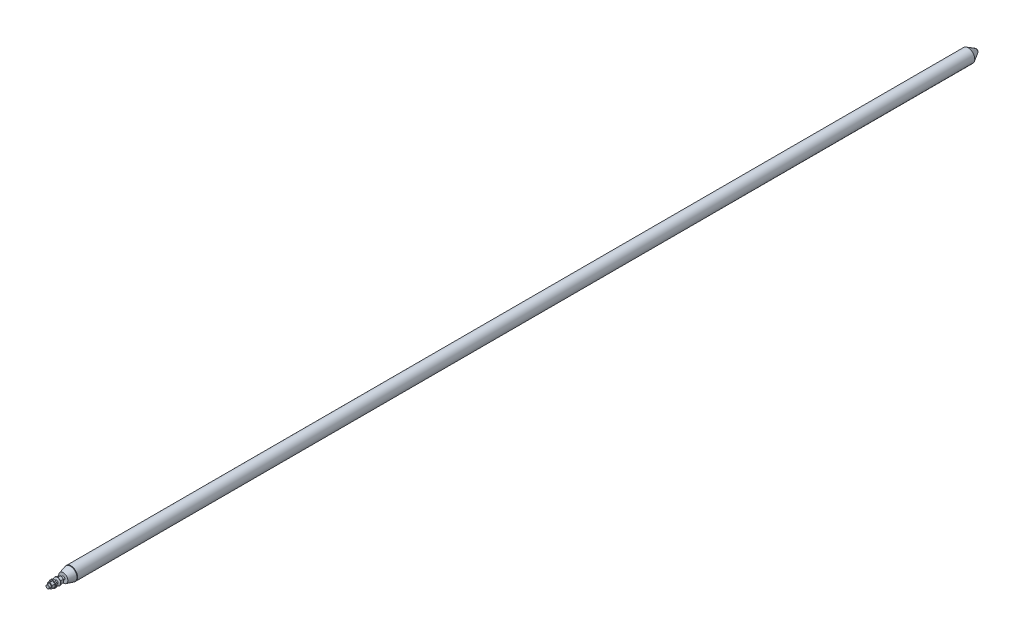
ISO-10303-21;
HEADER;
FILE_DESCRIPTION(('STEP AP214'),'2;1');
FILE_NAME('part.step','',(''),(''),'','','');
FILE_SCHEMA(('AUTOMOTIVE_DESIGN { 1 0 10303 214 1 1 1 1 }'));
ENDSEC;
DATA;
#1=APPLICATION_CONTEXT('core data for automotive mechanical design processes');
#2=APPLICATION_PROTOCOL_DEFINITION('international standard','automotive_design',2000,#1);
#3=PRODUCT_CONTEXT('',#1,'mechanical');
#4=PRODUCT('Part','Part','',(#3));
#5=PRODUCT_RELATED_PRODUCT_CATEGORY('part','',(#4));
#6=PRODUCT_DEFINITION_FORMATION('','',#4);
#7=PRODUCT_DEFINITION_CONTEXT('part definition',#1,'design');
#8=PRODUCT_DEFINITION('design','',#6,#7);
#9=PRODUCT_DEFINITION_SHAPE('','',#8);
#10=(LENGTH_UNIT() NAMED_UNIT(*) SI_UNIT(.MILLI.,.METRE.));
#11=(NAMED_UNIT(*) PLANE_ANGLE_UNIT() SI_UNIT($,.RADIAN.));
#12=(NAMED_UNIT(*) SI_UNIT($,.STERADIAN.) SOLID_ANGLE_UNIT());
#13=UNCERTAINTY_MEASURE_WITH_UNIT(LENGTH_MEASURE(1.E-05),#10,'distance_accuracy_value','');
#14=(GEOMETRIC_REPRESENTATION_CONTEXT(3) GLOBAL_UNCERTAINTY_ASSIGNED_CONTEXT((#13)) GLOBAL_UNIT_ASSIGNED_CONTEXT((#10,
#11,#12)) REPRESENTATION_CONTEXT('',''));
#15=CARTESIAN_POINT('',(0.,0.,0.));
#16=DIRECTION('',(0.,0.,1.));
#17=DIRECTION('',(1.,0.,0.));
#18=AXIS2_PLACEMENT_3D('',#15,#16,#17);
#19=CARTESIAN_POINT('',(0.,16.6751,52.1089983991226));
#20=DIRECTION('',(0.,0.,1.));
#21=DIRECTION('',(1.,0.,0.));
#22=AXIS2_PLACEMENT_3D('',#19,#20,#21);
#23=PLANE('',#22);
#24=CARTESIAN_POINT('',(0.,0.,52.1089983991226));
#25=DIRECTION('',(0.,0.,-1.));
#26=DIRECTION('',(-1.,0.,0.));
#27=AXIS2_PLACEMENT_3D('',#24,#25,#26);
#28=CIRCLE('',#27,16.6751);
#29=CARTESIAN_POINT('',(-16.6751,0.,52.1089983991226));
#30=VERTEX_POINT('',#29);
#31=EDGE_CURVE('E149',#30,#30,#28,.T.);
#32=ORIENTED_EDGE('',*,*,#31,.F.);
#33=EDGE_LOOP('',(#32));
#34=FACE_BOUND('',#33,.T.);
#35=DIRECTION('',(0.866025403784438,0.5,0.));
#36=VECTOR('',#35,1.);
#37=CARTESIAN_POINT('',(0.,-13.7554856334967,52.1089983991226));
#38=LINE('',#37,#36);
#39=CARTESIAN_POINT('',(0.,-13.7554856334967,52.1089983991226));
#40=VERTEX_POINT('',#39);
#41=CARTESIAN_POINT('',(11.9126,-6.87774281674833,52.1089983991226));
#42=VERTEX_POINT('',#41);
#43=EDGE_CURVE('E626',#40,#42,#38,.T.);
#44=ORIENTED_EDGE('',*,*,#43,.F.);
#45=DIRECTION('',(0.866025403784439,-0.499999999999999,0.));
#46=VECTOR('',#45,1.);
#47=CARTESIAN_POINT('',(-11.9126,-6.87774281674834,52.1089983991226));
#48=LINE('',#47,#46);
#49=CARTESIAN_POINT('',(-11.9126,-6.87774281674834,52.1089983991226));
#50=VERTEX_POINT('',#49);
#51=EDGE_CURVE('E147',#50,#40,#48,.T.);
#52=ORIENTED_EDGE('',*,*,#51,.F.);
#53=DIRECTION('',(0.,-1.,0.));
#54=VECTOR('',#53,1.);
#55=CARTESIAN_POINT('',(-11.9126,6.87774281674833,52.1089983991226));
#56=LINE('',#55,#54);
#57=CARTESIAN_POINT('',(-11.9126,6.87774281674833,52.1089983991226));
#58=VERTEX_POINT('',#57);
#59=EDGE_CURVE('E143',#58,#50,#56,.T.);
#60=ORIENTED_EDGE('',*,*,#59,.F.);
#61=DIRECTION('',(-0.866025403784439,-0.5,0.));
#62=VECTOR('',#61,1.);
#63=CARTESIAN_POINT('',(0.,13.7554856334967,52.1089983991226));
#64=LINE('',#63,#62);
#65=CARTESIAN_POINT('',(0.,13.7554856334967,52.1089983991226));
#66=VERTEX_POINT('',#65);
#67=EDGE_CURVE('E622',#66,#58,#64,.T.);
#68=ORIENTED_EDGE('',*,*,#67,.F.);
#69=DIRECTION('',(-0.866025403784439,0.5,0.));
#70=VECTOR('',#69,1.);
#71=CARTESIAN_POINT('',(11.9126,6.87774281674833,52.1089983991226));
#72=LINE('',#71,#70);
#73=CARTESIAN_POINT('',(11.9126,6.87774281674833,52.1089983991226));
#74=VERTEX_POINT('',#73);
#75=EDGE_CURVE('E634',#74,#66,#72,.T.);
#76=ORIENTED_EDGE('',*,*,#75,.F.);
#77=DIRECTION('',(0.,1.,0.));
#78=VECTOR('',#77,1.);
#79=CARTESIAN_POINT('',(11.9126,-6.87774281674833,52.1089983991226));
#80=LINE('',#79,#78);
#81=EDGE_CURVE('E628',#42,#74,#80,.T.);
#82=ORIENTED_EDGE('',*,*,#81,.F.);
#83=EDGE_LOOP('',(#44,#52,#60,#68,#76,#82));
#84=FACE_BOUND('',#83,.T.);
#85=ADVANCED_FACE('F33',(#34,#84),#23,.T.);
#86=CARTESIAN_POINT('',(0.,0.,0.));
#87=DIRECTION('',(0.,0.,-1.));
#88=DIRECTION('',(-1.,0.,0.));
#89=AXIS2_PLACEMENT_3D('',#86,#87,#88);
#90=CYLINDRICAL_SURFACE('',#89,7.93749999999999);
#91=CARTESIAN_POINT('',(0.,0.,46.2923983991226));
#92=DIRECTION('',(0.,0.,-1.));
#93=DIRECTION('',(-1.,0.,0.));
#94=AXIS2_PLACEMENT_3D('',#91,#92,#93);
#95=CIRCLE('',#94,7.93749999999999);
#96=CARTESIAN_POINT('',(-7.93749999999999,0.,46.2923983991226));
#97=VERTEX_POINT('',#96);
#98=EDGE_CURVE('E42',#97,#97,#95,.F.);
#99=ORIENTED_EDGE('',*,*,#98,.F.);
#100=EDGE_LOOP('',(#99));
#101=FACE_BOUND('',#100,.T.);
#102=CARTESIAN_POINT('',(0.,0.,33.5923983991226));
#103=DIRECTION('',(0.,0.,-1.));
#104=DIRECTION('',(-1.,0.,0.));
#105=AXIS2_PLACEMENT_3D('',#102,#103,#104);
#106=CIRCLE('',#105,7.93749999999999);
#107=CARTESIAN_POINT('',(0.,7.93749999999996,33.5923983991227));
#108=VERTEX_POINT('',#107);
#109=EDGE_CURVE('E236',#108,#108,#106,.T.);
#110=ORIENTED_EDGE('',*,*,#109,.F.);
#111=EDGE_LOOP('',(#110));
#112=FACE_BOUND('',#111,.T.);
#113=ADVANCED_FACE('F248',(#101,#112),#90,.T.);
#114=CARTESIAN_POINT('',(0.,0.,0.));
#115=DIRECTION('',(0.,0.,-1.));
#116=DIRECTION('',(-1.,0.,0.));
#117=AXIS2_PLACEMENT_3D('',#114,#115,#116);
#118=CIRCLE('',#117,7.93749999999999);
#119=CARTESIAN_POINT('',(-7.93749999999999,0.,0.));
#120=VERTEX_POINT('',#119);
#121=EDGE_CURVE('E224',#120,#120,#118,.T.);
#122=ORIENTED_EDGE('',*,*,#121,.F.);
#123=EDGE_LOOP('',(#122));
#124=FACE_BOUND('',#123,.T.);
#125=CARTESIAN_POINT('',(0.,0.,12.690475));
#126=DIRECTION('',(0.,0.,1.));
#127=DIRECTION('',(1.,0.,0.));
#128=AXIS2_PLACEMENT_3D('',#125,#126,#127);
#129=CIRCLE('',#128,7.93749999999999);
#130=CARTESIAN_POINT('',(7.93749999999999,0.,12.690475));
#131=VERTEX_POINT('',#130);
#132=EDGE_CURVE('E201',#131,#131,#129,.F.);
#133=ORIENTED_EDGE('',*,*,#132,.T.);
#134=EDGE_LOOP('',(#133));
#135=FACE_BOUND('',#134,.T.);
#136=ADVANCED_FACE('F251',(#124,#135),#90,.T.);
#137=CARTESIAN_POINT('',(0.,0.,-38.1));
#138=DIRECTION('',(0.,0.,1.));
#139=DIRECTION('',(1.,0.,0.));
#140=AXIS2_PLACEMENT_3D('',#137,#138,#139);
#141=CONICAL_SURFACE('',#140,28.575,0.780728808749583);
#142=CARTESIAN_POINT('',(0.,0.,-34.8952102827305));
#143=DIRECTION('',(0.,0.,-1.));
#144=DIRECTION('',(-1.,0.,0.));
#145=AXIS2_PLACEMENT_3D('',#142,#143,#144);
#146=CIRCLE('',#145,31.75);
#147=CARTESIAN_POINT('',(-31.75,0.,-34.8952102827305));
#148=VERTEX_POINT('',#147);
#149=EDGE_CURVE('E230',#148,#148,#146,.T.);
#150=ORIENTED_EDGE('',*,*,#149,.T.);
#151=EDGE_LOOP('',(#150));
#152=FACE_BOUND('',#151,.T.);
#153=CARTESIAN_POINT('',(0.,0.,-38.1));
#154=DIRECTION('',(0.,0.,-1.));
#155=DIRECTION('',(-1.,0.,0.));
#156=AXIS2_PLACEMENT_3D('',#153,#154,#155);
#157=CIRCLE('',#156,28.575);
#158=CARTESIAN_POINT('',(-28.575,0.,-38.1));
#159=VERTEX_POINT('',#158);
#160=EDGE_CURVE('E233',#159,#159,#157,.T.);
#161=ORIENTED_EDGE('',*,*,#160,.F.);
#162=EDGE_LOOP('',(#161));
#163=FACE_BOUND('',#162,.T.);
#164=ADVANCED_FACE('F454',(#152,#163),#141,.T.);
#165=CARTESIAN_POINT('',(0.,0.,-34.8952102827305));
#166=DIRECTION('',(0.,0.,-1.));
#167=DIRECTION('',(-1.,0.,0.));
#168=AXIS2_PLACEMENT_3D('',#165,#166,#167);
#169=CONICAL_SURFACE('',#168,31.75,0.266468742447018);
#170=CARTESIAN_POINT('',(0.,0.,0.));
#171=DIRECTION('',(0.,0.,-1.));
#172=DIRECTION('',(-1.,0.,0.));
#173=AXIS2_PLACEMENT_3D('',#170,#171,#172);
#174=CIRCLE('',#173,22.225);
#175=CARTESIAN_POINT('',(-22.225,0.,0.));
#176=VERTEX_POINT('',#175);
#177=EDGE_CURVE('E227',#176,#176,#174,.T.);
#178=ORIENTED_EDGE('',*,*,#177,.T.);
#179=EDGE_LOOP('',(#178));
#180=FACE_BOUND('',#179,.T.);
#181=ORIENTED_EDGE('',*,*,#149,.F.);
#182=EDGE_LOOP('',(#181));
#183=FACE_BOUND('',#182,.T.);
#184=ADVANCED_FACE('F540',(#180,#183),#169,.T.);
#185=CARTESIAN_POINT('',(0.,7.93749999999999,0.));
#186=DIRECTION('',(0.,0.,1.));
#187=DIRECTION('',(1.,0.,0.));
#188=AXIS2_PLACEMENT_3D('',#185,#186,#187);
#189=PLANE('',#188);
#190=ORIENTED_EDGE('',*,*,#121,.T.);
#191=EDGE_LOOP('',(#190));
#192=FACE_BOUND('',#191,.T.);
#193=ORIENTED_EDGE('',*,*,#177,.F.);
#194=EDGE_LOOP('',(#193));
#195=FACE_BOUND('',#194,.T.);
#196=ADVANCED_FACE('F527',(#192,#195),#189,.T.);
#197=CARTESIAN_POINT('',(0.,31.75,-38.1));
#198=DIRECTION('',(0.,0.,-1.));
#199=DIRECTION('',(-1.,0.,0.));
#200=AXIS2_PLACEMENT_3D('',#197,#198,#199);
#201=PLANE('',#200);
#202=ORIENTED_EDGE('',*,*,#160,.T.);
#203=EDGE_LOOP('',(#202));
#204=FACE_BOUND('',#203,.T.);
#205=CARTESIAN_POINT('',(0.,0.,-38.1));
#206=DIRECTION('',(0.,0.,1.));
#207=DIRECTION('',(1.,0.,0.));
#208=AXIS2_PLACEMENT_3D('',#205,#206,#207);
#209=CIRCLE('',#208,31.75);
#210=CARTESIAN_POINT('',(31.75,0.,-38.1));
#211=VERTEX_POINT('',#210);
#212=EDGE_CURVE('E205',#211,#211,#209,.T.);
#213=ORIENTED_EDGE('',*,*,#212,.T.);
#214=EDGE_LOOP('',(#213));
#215=FACE_BOUND('',#214,.T.);
#216=ADVANCED_FACE('F523',(#204,#215),#201,.F.);
#217=CARTESIAN_POINT('',(0.,0.,29.7434));
#218=DIRECTION('',(0.,0.,1.));
#219=DIRECTION('',(1.,0.,0.));
#220=AXIS2_PLACEMENT_3D('',#217,#218,#219);
#221=CYLINDRICAL_SURFACE('',#220,31.75);
#222=ORIENTED_EDGE('',*,*,#212,.F.);
#223=EDGE_LOOP('',(#222));
#224=FACE_BOUND('',#223,.T.);
#225=CARTESIAN_POINT('',(0.,0.,-4408.67479249755));
#226=DIRECTION('',(0.,0.,1.));
#227=DIRECTION('',(1.,0.,0.));
#228=AXIS2_PLACEMENT_3D('',#225,#226,#227);
#229=CIRCLE('',#228,31.75);
#230=CARTESIAN_POINT('',(31.75,0.,-4408.67479249755));
#231=VERTEX_POINT('',#230);
#232=EDGE_CURVE('E208',#231,#231,#229,.T.);
#233=ORIENTED_EDGE('',*,*,#232,.T.);
#234=EDGE_LOOP('',(#233));
#235=FACE_BOUND('',#234,.T.);
#236=ADVANCED_FACE('F526',(#224,#235),#221,.T.);
#237=CARTESIAN_POINT('',(0.,0.,-4444.61740563787));
#238=DIRECTION('',(0.,0.,1.));
#239=DIRECTION('',(1.,0.,0.));
#240=AXIS2_PLACEMENT_3D('',#237,#238,#239);
#241=CONICAL_SURFACE('',#240,10.9985226280625,0.523598775598292);
#242=ORIENTED_EDGE('',*,*,#232,.F.);
#243=EDGE_LOOP('',(#242));
#244=FACE_BOUND('',#243,.T.);
#245=CARTESIAN_POINT('',(0.,0.,-4444.61740563787));
#246=DIRECTION('',(0.,0.,1.));
#247=DIRECTION('',(1.,0.,0.));
#248=AXIS2_PLACEMENT_3D('',#245,#246,#247);
#249=CIRCLE('',#248,10.9985226280625);
#250=CARTESIAN_POINT('',(10.9985226280625,0.,-4444.61740563787));
#251=VERTEX_POINT('',#250);
#252=EDGE_CURVE('E211',#251,#251,#249,.T.);
#253=ORIENTED_EDGE('',*,*,#252,.T.);
#254=EDGE_LOOP('',(#253));
#255=FACE_BOUND('',#254,.T.);
#256=ADVANCED_FACE('F531',(#244,#255),#241,.T.);
#257=CARTESIAN_POINT('',(0.,0.,-4438.26740563787));
#258=DIRECTION('',(0.,0.,1.));
#259=DIRECTION('',(0.,1.,0.));
#260=AXIS2_PLACEMENT_3D('',#257,#258,#259);
#261=SPHERICAL_SURFACE('',#260,12.7);
#262=ORIENTED_EDGE('',*,*,#252,.F.);
#263=EDGE_LOOP('',(#262));
#264=FACE_BOUND('',#263,.T.);
#265=ADVANCED_FACE('F464',(#264),#261,.T.);
#266=CARTESIAN_POINT('',(13.5001,-7.79428636908687,12.690475));
#267=DIRECTION('',(-0.499999999999999,0.866025403784439,0.));
#268=DIRECTION('',(-0.866025403784439,-0.5,0.));
#269=AXIS2_PLACEMENT_3D('',#266,#267,#268);
#270=PLANE('',#269);
#271=DIRECTION('',(-0.866025403784439,-0.499999999999999,0.));
#272=VECTOR('',#271,1.);
#273=CARTESIAN_POINT('',(13.5001,-7.79428636908687,28.1686));
#274=LINE('',#273,#272);
#275=CARTESIAN_POINT('',(13.5001,-7.79428636908687,28.1686));
#276=VERTEX_POINT('',#275);
#277=CARTESIAN_POINT('',(0.,-15.5885727381737,28.1686));
#278=VERTEX_POINT('',#277);
#279=EDGE_CURVE('E160',#276,#278,#274,.T.);
#280=ORIENTED_EDGE('',*,*,#279,.T.);
#281=DIRECTION('',(0.,0.,1.));
#282=VECTOR('',#281,1.);
#283=CARTESIAN_POINT('',(0.,-15.5885727381737,12.690475));
#284=LINE('',#283,#282);
#285=CARTESIAN_POINT('',(0.,-15.5885727381737,12.690475));
#286=VERTEX_POINT('',#285);
#287=EDGE_CURVE('E199',#286,#278,#284,.T.);
#288=ORIENTED_EDGE('',*,*,#287,.F.);
#289=DIRECTION('',(-0.866025403784439,-0.499999999999999,0.));
#290=VECTOR('',#289,1.);
#291=CARTESIAN_POINT('',(13.5001,-7.79428636908687,12.690475));
#292=LINE('',#291,#290);
#293=CARTESIAN_POINT('',(13.5001,-7.79428636908687,12.690475));
#294=VERTEX_POINT('',#293);
#295=EDGE_CURVE('E161',#294,#286,#292,.T.);
#296=ORIENTED_EDGE('',*,*,#295,.F.);
#297=DIRECTION('',(0.,0.,1.));
#298=VECTOR('',#297,1.);
#299=CARTESIAN_POINT('',(13.5001,-7.79428636908687,12.690475));
#300=LINE('',#299,#298);
#301=EDGE_CURVE('E175',#294,#276,#300,.T.);
#302=ORIENTED_EDGE('',*,*,#301,.T.);
#303=EDGE_LOOP('',(#280,#288,#296,#302));
#304=FACE_BOUND('',#303,.T.);
#305=ADVANCED_FACE('F292',(#304),#270,.F.);
#306=CARTESIAN_POINT('',(0.,-15.5885727381737,12.690475));
#307=DIRECTION('',(0.5,0.866025403784438,0.));
#308=DIRECTION('',(-0.866025403784438,0.5,0.));
#309=AXIS2_PLACEMENT_3D('',#306,#307,#308);
#310=PLANE('',#309);
#311=DIRECTION('',(-0.866025403784438,0.5,0.));
#312=VECTOR('',#311,1.);
#313=CARTESIAN_POINT('',(0.,-15.5885727381737,28.1686));
#314=LINE('',#313,#312);
#315=CARTESIAN_POINT('',(-13.5001,-7.79428636908686,28.1686));
#316=VERTEX_POINT('',#315);
#317=EDGE_CURVE('E178',#278,#316,#314,.T.);
#318=ORIENTED_EDGE('',*,*,#317,.T.);
#319=DIRECTION('',(0.,0.,1.));
#320=VECTOR('',#319,1.);
#321=CARTESIAN_POINT('',(-13.5001,-7.79428636908686,12.690475));
#322=LINE('',#321,#320);
#323=CARTESIAN_POINT('',(-13.5001,-7.79428636908686,12.690475));
#324=VERTEX_POINT('',#323);
#325=EDGE_CURVE('E196',#324,#316,#322,.T.);
#326=ORIENTED_EDGE('',*,*,#325,.F.);
#327=DIRECTION('',(-0.866025403784438,0.5,0.));
#328=VECTOR('',#327,1.);
#329=CARTESIAN_POINT('',(0.,-15.5885727381737,12.690475));
#330=LINE('',#329,#328);
#331=EDGE_CURVE('E164',#286,#324,#330,.T.);
#332=ORIENTED_EDGE('',*,*,#331,.F.);
#333=ORIENTED_EDGE('',*,*,#287,.T.);
#334=EDGE_LOOP('',(#318,#326,#332,#333));
#335=FACE_BOUND('',#334,.T.);
#336=ADVANCED_FACE('F280',(#335),#310,.F.);
#337=CARTESIAN_POINT('',(-13.5001,-7.79428636908686,12.690475));
#338=DIRECTION('',(1.,0.,0.));
#339=DIRECTION('',(0.,1.,0.));
#340=AXIS2_PLACEMENT_3D('',#337,#338,#339);
#341=PLANE('',#340);
#342=DIRECTION('',(0.,1.,0.));
#343=VECTOR('',#342,1.);
#344=CARTESIAN_POINT('',(-13.5001,-7.79428636908686,28.1686));
#345=LINE('',#344,#343);
#346=CARTESIAN_POINT('',(-13.5001,7.79428636908686,28.1686));
#347=VERTEX_POINT('',#346);
#348=EDGE_CURVE('E180',#316,#347,#345,.T.);
#349=ORIENTED_EDGE('',*,*,#348,.T.);
#350=DIRECTION('',(0.,0.,1.));
#351=VECTOR('',#350,1.);
#352=CARTESIAN_POINT('',(-13.5001,7.79428636908686,12.690475));
#353=LINE('',#352,#351);
#354=CARTESIAN_POINT('',(-13.5001,7.79428636908686,12.690475));
#355=VERTEX_POINT('',#354);
#356=EDGE_CURVE('E193',#355,#347,#353,.T.);
#357=ORIENTED_EDGE('',*,*,#356,.F.);
#358=DIRECTION('',(0.,1.,0.));
#359=VECTOR('',#358,1.);
#360=CARTESIAN_POINT('',(-13.5001,-7.79428636908686,12.690475));
#361=LINE('',#360,#359);
#362=EDGE_CURVE('E167',#324,#355,#361,.T.);
#363=ORIENTED_EDGE('',*,*,#362,.F.);
#364=ORIENTED_EDGE('',*,*,#325,.T.);
#365=EDGE_LOOP('',(#349,#357,#363,#364));
#366=FACE_BOUND('',#365,.T.);
#367=ADVANCED_FACE('F284',(#366),#341,.F.);
#368=CARTESIAN_POINT('',(-13.5001,7.79428636908686,12.690475));
#369=DIRECTION('',(0.5,-0.866025403784439,0.));
#370=DIRECTION('',(0.866025403784439,0.5,0.));
#371=AXIS2_PLACEMENT_3D('',#368,#369,#370);
#372=PLANE('',#371);
#373=DIRECTION('',(0.866025403784439,0.5,0.));
#374=VECTOR('',#373,1.);
#375=CARTESIAN_POINT('',(-13.5001,7.79428636908686,28.1686));
#376=LINE('',#375,#374);
#377=CARTESIAN_POINT('',(0.,15.5885727381737,28.1686));
#378=VERTEX_POINT('',#377);
#379=EDGE_CURVE('E182',#347,#378,#376,.T.);
#380=ORIENTED_EDGE('',*,*,#379,.T.);
#381=DIRECTION('',(0.,0.,1.));
#382=VECTOR('',#381,1.);
#383=CARTESIAN_POINT('',(0.,15.5885727381737,12.690475));
#384=LINE('',#383,#382);
#385=CARTESIAN_POINT('',(0.,15.5885727381737,12.690475));
#386=VERTEX_POINT('',#385);
#387=EDGE_CURVE('E190',#386,#378,#384,.T.);
#388=ORIENTED_EDGE('',*,*,#387,.F.);
#389=DIRECTION('',(0.866025403784439,0.5,0.));
#390=VECTOR('',#389,1.);
#391=CARTESIAN_POINT('',(-13.5001,7.79428636908686,12.690475));
#392=LINE('',#391,#390);
#393=EDGE_CURVE('E169',#355,#386,#392,.T.);
#394=ORIENTED_EDGE('',*,*,#393,.F.);
#395=ORIENTED_EDGE('',*,*,#356,.T.);
#396=EDGE_LOOP('',(#380,#388,#394,#395));
#397=FACE_BOUND('',#396,.T.);
#398=ADVANCED_FACE('F299',(#397),#372,.F.);
#399=CARTESIAN_POINT('',(0.,15.5885727381737,12.690475));
#400=DIRECTION('',(-0.5,-0.866025403784438,0.));
#401=DIRECTION('',(0.866025403784439,-0.5,0.));
#402=AXIS2_PLACEMENT_3D('',#399,#400,#401);
#403=PLANE('',#402);
#404=DIRECTION('',(0.866025403784438,-0.5,0.));
#405=VECTOR('',#404,1.);
#406=CARTESIAN_POINT('',(0.,15.5885727381737,28.1686));
#407=LINE('',#406,#405);
#408=CARTESIAN_POINT('',(13.5001,7.79428636908686,28.1686));
#409=VERTEX_POINT('',#408);
#410=EDGE_CURVE('E184',#378,#409,#407,.T.);
#411=ORIENTED_EDGE('',*,*,#410,.T.);
#412=DIRECTION('',(0.,0.,1.));
#413=VECTOR('',#412,1.);
#414=CARTESIAN_POINT('',(13.5001,7.79428636908686,12.690475));
#415=LINE('',#414,#413);
#416=CARTESIAN_POINT('',(13.5001,7.79428636908686,12.690475));
#417=VERTEX_POINT('',#416);
#418=EDGE_CURVE('E57',#417,#409,#415,.T.);
#419=ORIENTED_EDGE('',*,*,#418,.F.);
#420=DIRECTION('',(0.866025403784438,-0.5,0.));
#421=VECTOR('',#420,1.);
#422=CARTESIAN_POINT('',(0.,15.5885727381737,12.690475));
#423=LINE('',#422,#421);
#424=EDGE_CURVE('E171',#386,#417,#423,.T.);
#425=ORIENTED_EDGE('',*,*,#424,.F.);
#426=ORIENTED_EDGE('',*,*,#387,.T.);
#427=EDGE_LOOP('',(#411,#419,#425,#426));
#428=FACE_BOUND('',#427,.T.);
#429=ADVANCED_FACE('F296',(#428),#403,.F.);
#430=CARTESIAN_POINT('',(13.5001,7.79428636908686,12.690475));
#431=DIRECTION('',(-1.,0.,0.));
#432=DIRECTION('',(0.,0.,1.));
#433=AXIS2_PLACEMENT_3D('',#430,#431,#432);
#434=PLANE('',#433);
#435=DIRECTION('',(0.,-1.,0.));
#436=VECTOR('',#435,1.);
#437=CARTESIAN_POINT('',(13.5001,7.79428636908686,28.1686));
#438=LINE('',#437,#436);
#439=EDGE_CURVE('E165',#409,#276,#438,.T.);
#440=ORIENTED_EDGE('',*,*,#439,.T.);
#441=ORIENTED_EDGE('',*,*,#301,.F.);
#442=DIRECTION('',(0.,-1.,0.));
#443=VECTOR('',#442,1.);
#444=CARTESIAN_POINT('',(13.5001,7.79428636908686,12.690475));
#445=LINE('',#444,#443);
#446=EDGE_CURVE('E173',#417,#294,#445,.T.);
#447=ORIENTED_EDGE('',*,*,#446,.F.);
#448=ORIENTED_EDGE('',*,*,#418,.T.);
#449=EDGE_LOOP('',(#440,#441,#447,#448));
#450=FACE_BOUND('',#449,.T.);
#451=ADVANCED_FACE('F293',(#450),#434,.F.);
#452=CARTESIAN_POINT('',(13.5001,-7.79428636908687,12.690475));
#453=DIRECTION('',(0.,0.,1.));
#454=DIRECTION('',(1.,0.,0.));
#455=AXIS2_PLACEMENT_3D('',#452,#453,#454);
#456=PLANE('',#455);
#457=ORIENTED_EDGE('',*,*,#132,.F.);
#458=EDGE_LOOP('',(#457));
#459=FACE_BOUND('',#458,.T.);
#460=ORIENTED_EDGE('',*,*,#295,.T.);
#461=ORIENTED_EDGE('',*,*,#331,.T.);
#462=ORIENTED_EDGE('',*,*,#362,.T.);
#463=ORIENTED_EDGE('',*,*,#393,.T.);
#464=ORIENTED_EDGE('',*,*,#424,.T.);
#465=ORIENTED_EDGE('',*,*,#446,.T.);
#466=EDGE_LOOP('',(#460,#461,#462,#463,#464,#465));
#467=FACE_BOUND('',#466,.T.);
#468=ADVANCED_FACE('F260',(#459,#467),#456,.F.);
#469=CARTESIAN_POINT('',(0.,0.,0.0435161764705885));
#470=DIRECTION('',(0.,0.,-1.));
#471=DIRECTION('',(0.,1.,0.));
#472=AXIS2_PLACEMENT_3D('',#469,#470,#471);
#473=SPHERICAL_SURFACE('',#472,34.4750838235294);
#474=CARTESIAN_POINT('',(0.,0.,29.7688));
#475=DIRECTION('',(0.,0.,-1.));
#476=DIRECTION('',(-1.,0.,0.));
#477=AXIS2_PLACEMENT_3D('',#474,#475,#476);
#478=CIRCLE('',#477,17.4625);
#479=CARTESIAN_POINT('',(0.,17.4625,29.7688));
#480=VERTEX_POINT('',#479);
#481=EDGE_CURVE('E215',#480,#480,#478,.T.);
#482=CARTESIAN_POINT('',(0.,7.93749999999996,33.5923983991227));
#483=CARTESIAN_POINT('',(0.,8.04193033230631,33.5676907138939));
#484=CARTESIAN_POINT('',(0.,8.14624529277318,33.5424953955937));
#485=CARTESIAN_POINT('',(0.,8.35463538983752,33.4911317569022));
#486=CARTESIAN_POINT('',(0.,8.458710526435,33.464963436511));
#487=CARTESIAN_POINT('',(0.,8.66661189557016,33.4116560576896));
#488=CARTESIAN_POINT('',(0.,8.77043812810784,33.3845169992594));
#489=CARTESIAN_POINT('',(0.,8.97783263624223,33.3292705157999));
#490=CARTESIAN_POINT('',(0.,9.08140091183892,33.3011630907704));
#491=CARTESIAN_POINT('',(0.,9.28827047420351,33.2439823239056));
#492=CARTESIAN_POINT('',(0.,9.39157176097139,33.2149089820701));
#493=CARTESIAN_POINT('',(0.,9.59789833747534,33.1557989172506));
#494=CARTESIAN_POINT('',(0.,9.7009236272114,33.1257621942665));
#495=CARTESIAN_POINT('',(0.,9.90668922540895,33.0647279863804));
#496=CARTESIAN_POINT('',(0.,10.0094295338704,33.0337305014784));
#497=CARTESIAN_POINT('',(0.,10.2146162101565,32.9707774728867));
#498=CARTESIAN_POINT('',(0.,10.3170625779811,32.938821929197));
#499=CARTESIAN_POINT('',(0.,10.521652439256,32.8739555696753));
#500=CARTESIAN_POINT('',(0.,10.6237959327063,32.8410447538433));
#501=CARTESIAN_POINT('',(0.,10.8277711379095,32.7742707199945));
#502=CARTESIAN_POINT('',(0.,10.9296028496623,32.7404075019776));
#503=CARTESIAN_POINT('',(0.,11.132945611335,32.6717316167674));
#504=CARTESIAN_POINT('',(0.,11.234456661255,32.636918949574));
#505=CARTESIAN_POINT('',(0.,11.4371492470899,32.5663472018157));
#506=CARTESIAN_POINT('',(0.,11.5383307830049,32.5305881212508));
#507=CARTESIAN_POINT('',(0.,11.7403555173927,32.458126665085));
#508=CARTESIAN_POINT('',(0.,11.8411987158655,32.4214242894841));
#509=CARTESIAN_POINT('',(0.,12.042537981436,32.3470794438415));
#510=CARTESIAN_POINT('',(0.,12.1430340485337,32.3094369737997));
#511=CARTESIAN_POINT('',(0.,12.3436702876927,32.2332152218499));
#512=CARTESIAN_POINT('',(0.,12.4438104597538,32.194635939942));
#513=CARTESIAN_POINT('',(0.,12.6437261762134,32.1165439285288));
#514=CARTESIAN_POINT('',(0.,12.7435017206118,32.0770311990235));
#515=CARTESIAN_POINT('',(0.,12.9426794809169,31.9970757380846));
#516=CARTESIAN_POINT('',(0.,13.0420816968236,31.956633006651));
#517=CARTESIAN_POINT('',(0.,13.2405041318717,31.8748210686243));
#518=CARTESIAN_POINT('',(0.,13.3395243510132,31.8334518620313));
#519=CARTESIAN_POINT('',(0.,13.5371741575694,31.7497905812473));
#520=CARTESIAN_POINT('',(0.,13.6358037449841,31.7074985070563));
#521=CARTESIAN_POINT('',(0.,13.8326636871895,31.6219951791153));
#522=CARTESIAN_POINT('',(0.,13.9308940419803,31.5787839253653));
#523=CARTESIAN_POINT('',(0.,14.1269469528556,31.4914460065018));
#524=CARTESIAN_POINT('',(0.,14.2247695089402,31.4473193413882));
#525=CARTESIAN_POINT('',(0.,14.4199982918825,31.3581544478201));
#526=CARTESIAN_POINT('',(0.,14.5174045187402,31.3131162193657));
#527=CARTESIAN_POINT('',(0.,14.7117921490136,31.2221321266308));
#528=CARTESIAN_POINT('',(0.,14.8087735524293,31.1761862623503));
#529=CARTESIAN_POINT('',(0.,15.0023030786502,31.0833909046278));
#530=CARTESIAN_POINT('',(0.,15.0988512014553,31.0365414111859));
#531=CARTESIAN_POINT('',(0.,15.2915057470694,30.9419428806036));
#532=CARTESIAN_POINT('',(0.,15.3876121698782,30.8941938434631));
#533=CARTESIAN_POINT('',(0.,15.579374934636,30.7978003893978));
#534=CARTESIAN_POINT('',(0.,15.675031276585,30.749155972473));
#535=CARTESIAN_POINT('',(0.,15.8658855379922,30.6509760008058));
#536=CARTESIAN_POINT('',(0.,15.9610834574505,30.6014404460634));
#537=CARTESIAN_POINT('',(0.,16.1510125722821,30.5014825185434));
#538=CARTESIAN_POINT('',(0.,16.2457437676554,30.4510601457658));
#539=CARTESIAN_POINT('',(0.,16.4347311731984,30.3493329789012));
#540=CARTESIAN_POINT('',(0.,16.5289873833681,30.2980281848143));
#541=CARTESIAN_POINT('',(0.,16.7170165996438,30.194540650465));
#542=CARTESIAN_POINT('',(0.,16.8107896057498,30.1423579102026));
#543=CARTESIAN_POINT('',(0.,16.9978442340481,30.0371190297578));
#544=CARTESIAN_POINT('',(0.,17.0911258562404,29.9840628895754));
#545=CARTESIAN_POINT('',(0.,17.2771895913833,29.877081852009));
#546=CARTESIAN_POINT('',(0.,17.369971704334,29.8231569546252));
#547=CARTESIAN_POINT('',(0.,17.4625,29.7688));
#548=B_SPLINE_CURVE_WITH_KNOTS('',3,(#482,#483,#484,#485,#486,#487,#488,#489,#490,#491,#492,
#493,#494,#495,#496,#497,#498,#499,#500,#501,#502,#503,#504,#505,#506,#507,#508,#509,#510,#511,
#512,#513,#514,#515,#516,#517,#518,#519,#520,#521,#522,#523,#524,#525,#526,#527,#528,#529,#530,
#531,#532,#533,#534,#535,#536,#537,#538,#539,#540,#541,#542,#543,#544,#545,#546,#547),
.UNSPECIFIED.,.F.,.F.,(4,2,2,2,2,2,2,2,2,2,2,2,2,2,2,2,2,2,2,2,2,2,2,2,2,2,2,2,2,2,2,2,4),(0.,
0.321939004572816,0.643878009145632,0.965817013718447,1.28775601829126,1.60969502286408,
1.9316340274369,2.25357303200971,2.57551203658253,2.89745104115534,3.21939004572815,
3.54132905030097,3.86326805487378,4.1852070594466,4.50714606401941,4.82908506859223,
5.15102407316505,5.47296307773786,5.79490208231068,6.11684108688349,6.43878009145631,
6.76071909602913,7.08265810060194,7.40459710517475,7.72653610974757,8.04847511432038,
8.3704141188932,8.69235312346602,9.01429212803883,9.33623113261165,9.65817013718446,
9.98010914175728,10.3020481463301),.UNSPECIFIED.);
#549=EDGE_CURVE('BSEAM256',#108,#480,#548,.T.);
#550=ORIENTED_EDGE('',*,*,#109,.T.);
#551=ORIENTED_EDGE('',*,*,#481,.F.);
#552=ORIENTED_EDGE('',*,*,#549,.T.);
#553=ORIENTED_EDGE('',*,*,#549,.F.);
#554=EDGE_LOOP('',(#550,#552,#551,#553));
#555=FACE_BOUND('',#554,.T.);
#556=ADVANCED_FACE('F256',(#555),#473,.T.);
#557=CARTESIAN_POINT('',(0.,0.,0.));
#558=DIRECTION('',(0.,0.,-1.));
#559=DIRECTION('',(-1.,0.,0.));
#560=AXIS2_PLACEMENT_3D('',#557,#558,#559);
#561=CYLINDRICAL_SURFACE('',#560,17.4625);
#562=ORIENTED_EDGE('',*,*,#481,.T.);
#563=EDGE_LOOP('',(#562));
#564=FACE_BOUND('',#563,.T.);
#565=CARTESIAN_POINT('',(0.,0.,28.1686));
#566=DIRECTION('',(0.,0.,-1.));
#567=DIRECTION('',(-1.,0.,0.));
#568=AXIS2_PLACEMENT_3D('',#565,#566,#567);
#569=CIRCLE('',#568,17.4625);
#570=CARTESIAN_POINT('',(-17.4625,0.,28.1686));
#571=VERTEX_POINT('',#570);
#572=EDGE_CURVE('E218',#571,#571,#569,.T.);
#573=ORIENTED_EDGE('',*,*,#572,.F.);
#574=EDGE_LOOP('',(#573));
#575=FACE_BOUND('',#574,.T.);
#576=ADVANCED_FACE('F259',(#564,#575),#561,.T.);
#577=CARTESIAN_POINT('',(0.,0.,28.1686));
#578=DIRECTION('',(0.,0.,-1.));
#579=DIRECTION('',(-1.,0.,0.));
#580=AXIS2_PLACEMENT_3D('',#577,#578,#579);
#581=PLANE('',#580);
#582=ORIENTED_EDGE('',*,*,#572,.T.);
#583=EDGE_LOOP('',(#582));
#584=FACE_BOUND('',#583,.T.);
#585=ORIENTED_EDGE('',*,*,#317,.F.);
#586=ORIENTED_EDGE('',*,*,#279,.F.);
#587=ORIENTED_EDGE('',*,*,#439,.F.);
#588=ORIENTED_EDGE('',*,*,#410,.F.);
#589=ORIENTED_EDGE('',*,*,#379,.F.);
#590=ORIENTED_EDGE('',*,*,#348,.F.);
#591=EDGE_LOOP('',(#585,#586,#587,#588,#589,#590));
#592=FACE_BOUND('',#591,.T.);
#593=ADVANCED_FACE('F266',(#584,#592),#581,.T.);
#594=CARTESIAN_POINT('',(0.,0.,46.2923983991226));
#595=DIRECTION('',(0.,0.,-1.));
#596=DIRECTION('',(-1.,0.,0.));
#597=AXIS2_PLACEMENT_3D('',#594,#595,#596);
#598=PLANE('',#597);
#599=ORIENTED_EDGE('',*,*,#98,.T.);
#600=EDGE_LOOP('',(#599));
#601=FACE_BOUND('',#600,.T.);
#602=CARTESIAN_POINT('',(0.,0.,46.2923983991226));
#603=DIRECTION('',(0.,0.,-1.));
#604=DIRECTION('',(-1.,0.,0.));
#605=AXIS2_PLACEMENT_3D('',#602,#603,#604);
#606=CIRCLE('',#605,16.6751);
#607=CARTESIAN_POINT('',(-16.6751,0.,46.2923983991226));
#608=VERTEX_POINT('',#607);
#609=EDGE_CURVE('E152',#608,#608,#606,.T.);
#610=ORIENTED_EDGE('',*,*,#609,.T.);
#611=EDGE_LOOP('',(#610));
#612=FACE_BOUND('',#611,.T.);
#613=ADVANCED_FACE('F245',(#601,#612),#598,.T.);
#614=CARTESIAN_POINT('',(0.,0.,0.));
#615=DIRECTION('',(0.,0.,-1.));
#616=DIRECTION('',(-1.,0.,0.));
#617=AXIS2_PLACEMENT_3D('',#614,#615,#616);
#618=CYLINDRICAL_SURFACE('',#617,16.6751);
#619=ORIENTED_EDGE('',*,*,#31,.T.);
#620=EDGE_LOOP('',(#619));
#621=FACE_BOUND('',#620,.T.);
#622=ORIENTED_EDGE('',*,*,#609,.F.);
#623=EDGE_LOOP('',(#622));
#624=FACE_BOUND('',#623,.T.);
#625=ADVANCED_FACE('F318',(#621,#624),#618,.T.);
#626=CARTESIAN_POINT('',(-11.9126,-6.87774281674834,65.9996233991226));
#627=DIRECTION('',(0.499999999999999,0.866025403784439,0.));
#628=DIRECTION('',(-0.866025403784439,0.499999999999999,0.));
#629=AXIS2_PLACEMENT_3D('',#626,#627,#628);
#630=PLANE('',#629);
#631=ORIENTED_EDGE('',*,*,#51,.T.);
#632=DIRECTION('',(0.,0.,-1.));
#633=VECTOR('',#632,1.);
#634=CARTESIAN_POINT('',(0.,-13.7554856334967,65.9996233991226));
#635=LINE('',#634,#633);
#636=CARTESIAN_POINT('',(0.,-13.7554856334967,65.9996233991226));
#637=VERTEX_POINT('',#636);
#638=EDGE_CURVE('E128',#637,#40,#635,.T.);
#639=ORIENTED_EDGE('',*,*,#638,.F.);
#640=DIRECTION('',(0.866025403784439,-0.499999999999999,0.));
#641=VECTOR('',#640,1.);
#642=CARTESIAN_POINT('',(-11.9126,-6.87774281674834,65.9996233991226));
#643=LINE('',#642,#641);
#644=CARTESIAN_POINT('',(-11.9126,-6.87774281674834,65.9996233991226));
#645=VERTEX_POINT('',#644);
#646=EDGE_CURVE('E135',#645,#637,#643,.T.);
#647=ORIENTED_EDGE('',*,*,#646,.F.);
#648=DIRECTION('',(0.,0.,-1.));
#649=VECTOR('',#648,1.);
#650=CARTESIAN_POINT('',(-11.9126,-6.87774281674834,65.9996233991226));
#651=LINE('',#650,#649);
#652=EDGE_CURVE('E620',#645,#50,#651,.T.);
#653=ORIENTED_EDGE('',*,*,#652,.T.);
#654=EDGE_LOOP('',(#631,#639,#647,#653));
#655=FACE_BOUND('',#654,.T.);
#656=ADVANCED_FACE('F145',(#655),#630,.F.);
#657=CARTESIAN_POINT('',(0.,-13.7554856334967,65.9996233991226));
#658=DIRECTION('',(-0.5,0.866025403784438,0.));
#659=DIRECTION('',(-0.866025403784438,-0.5,0.));
#660=AXIS2_PLACEMENT_3D('',#657,#658,#659);
#661=PLANE('',#660);
#662=ORIENTED_EDGE('',*,*,#43,.T.);
#663=DIRECTION('',(0.,0.,-1.));
#664=VECTOR('',#663,1.);
#665=CARTESIAN_POINT('',(11.9126,-6.87774281674833,65.9996233991226));
#666=LINE('',#665,#664);
#667=CARTESIAN_POINT('',(11.9126,-6.87774281674833,65.9996233991226));
#668=VERTEX_POINT('',#667);
#669=EDGE_CURVE('E131',#668,#42,#666,.T.);
#670=ORIENTED_EDGE('',*,*,#669,.F.);
#671=DIRECTION('',(0.866025403784438,0.5,0.));
#672=VECTOR('',#671,1.);
#673=CARTESIAN_POINT('',(0.,-13.7554856334967,65.9996233991226));
#674=LINE('',#673,#672);
#675=EDGE_CURVE('E124',#637,#668,#674,.T.);
#676=ORIENTED_EDGE('',*,*,#675,.F.);
#677=ORIENTED_EDGE('',*,*,#638,.T.);
#678=EDGE_LOOP('',(#662,#670,#676,#677));
#679=FACE_BOUND('',#678,.T.);
#680=ADVANCED_FACE('F126',(#679),#661,.F.);
#681=CARTESIAN_POINT('',(11.9126,-6.87774281674833,65.9996233991226));
#682=DIRECTION('',(-1.,0.,0.));
#683=DIRECTION('',(0.,-1.,0.));
#684=AXIS2_PLACEMENT_3D('',#681,#682,#683);
#685=PLANE('',#684);
#686=ORIENTED_EDGE('',*,*,#81,.T.);
#687=DIRECTION('',(0.,0.,-1.));
#688=VECTOR('',#687,1.);
#689=CARTESIAN_POINT('',(11.9126,6.87774281674833,65.9996233991226));
#690=LINE('',#689,#688);
#691=CARTESIAN_POINT('',(11.9126,6.87774281674833,65.9996233991226));
#692=VERTEX_POINT('',#691);
#693=EDGE_CURVE('E154',#692,#74,#690,.T.);
#694=ORIENTED_EDGE('',*,*,#693,.F.);
#695=DIRECTION('',(0.,1.,0.));
#696=VECTOR('',#695,1.);
#697=CARTESIAN_POINT('',(11.9126,-6.87774281674833,65.9996233991226));
#698=LINE('',#697,#696);
#699=EDGE_CURVE('E134',#668,#692,#698,.T.);
#700=ORIENTED_EDGE('',*,*,#699,.F.);
#701=ORIENTED_EDGE('',*,*,#669,.T.);
#702=EDGE_LOOP('',(#686,#694,#700,#701));
#703=FACE_BOUND('',#702,.T.);
#704=ADVANCED_FACE('F370',(#703),#685,.F.);
#705=CARTESIAN_POINT('',(11.9126,6.87774281674833,65.9996233991226));
#706=DIRECTION('',(-0.5,-0.866025403784439,0.));
#707=DIRECTION('',(0.866025403784439,-0.5,0.));
#708=AXIS2_PLACEMENT_3D('',#705,#706,#707);
#709=PLANE('',#708);
#710=ORIENTED_EDGE('',*,*,#75,.T.);
#711=DIRECTION('',(0.,0.,-1.));
#712=VECTOR('',#711,1.);
#713=CARTESIAN_POINT('',(0.,13.7554856334967,65.9996233991226));
#714=LINE('',#713,#712);
#715=CARTESIAN_POINT('',(0.,13.7554856334967,65.9996233991226));
#716=VERTEX_POINT('',#715);
#717=EDGE_CURVE('E638',#716,#66,#714,.T.);
#718=ORIENTED_EDGE('',*,*,#717,.F.);
#719=DIRECTION('',(-0.866025403784439,0.5,0.));
#720=VECTOR('',#719,1.);
#721=CARTESIAN_POINT('',(11.9126,6.87774281674833,65.9996233991226));
#722=LINE('',#721,#720);
#723=EDGE_CURVE('E645',#692,#716,#722,.T.);
#724=ORIENTED_EDGE('',*,*,#723,.F.);
#725=ORIENTED_EDGE('',*,*,#693,.T.);
#726=EDGE_LOOP('',(#710,#718,#724,#725));
#727=FACE_BOUND('',#726,.T.);
#728=ADVANCED_FACE('F376',(#727),#709,.F.);
#729=CARTESIAN_POINT('',(0.,13.7554856334967,65.9996233991226));
#730=DIRECTION('',(0.5,-0.866025403784439,0.));
#731=DIRECTION('',(0.866025403784439,0.5,0.));
#732=AXIS2_PLACEMENT_3D('',#729,#730,#731);
#733=PLANE('',#732);
#734=ORIENTED_EDGE('',*,*,#67,.T.);
#735=DIRECTION('',(0.,0.,-1.));
#736=VECTOR('',#735,1.);
#737=CARTESIAN_POINT('',(-11.9126,6.87774281674833,65.9996233991226));
#738=LINE('',#737,#736);
#739=CARTESIAN_POINT('',(-11.9126,6.87774281674833,65.9996233991226));
#740=VERTEX_POINT('',#739);
#741=EDGE_CURVE('E49',#740,#58,#738,.T.);
#742=ORIENTED_EDGE('',*,*,#741,.F.);
#743=DIRECTION('',(-0.866025403784439,-0.5,0.));
#744=VECTOR('',#743,1.);
#745=CARTESIAN_POINT('',(0.,13.7554856334967,65.9996233991226));
#746=LINE('',#745,#744);
#747=EDGE_CURVE('E647',#716,#740,#746,.T.);
#748=ORIENTED_EDGE('',*,*,#747,.F.);
#749=ORIENTED_EDGE('',*,*,#717,.T.);
#750=EDGE_LOOP('',(#734,#742,#748,#749));
#751=FACE_BOUND('',#750,.T.);
#752=ADVANCED_FACE('F384',(#751),#733,.F.);
#753=CARTESIAN_POINT('',(-11.9126,6.87774281674833,65.9996233991226));
#754=DIRECTION('',(1.,0.,0.));
#755=DIRECTION('',(0.,1.,0.));
#756=AXIS2_PLACEMENT_3D('',#753,#754,#755);
#757=PLANE('',#756);
#758=ORIENTED_EDGE('',*,*,#59,.T.);
#759=ORIENTED_EDGE('',*,*,#652,.F.);
#760=DIRECTION('',(0.,-1.,0.));
#761=VECTOR('',#760,1.);
#762=CARTESIAN_POINT('',(-11.9126,6.87774281674833,65.9996233991226));
#763=LINE('',#762,#761);
#764=EDGE_CURVE('E139',#740,#645,#763,.T.);
#765=ORIENTED_EDGE('',*,*,#764,.F.);
#766=ORIENTED_EDGE('',*,*,#741,.T.);
#767=EDGE_LOOP('',(#758,#759,#765,#766));
#768=FACE_BOUND('',#767,.T.);
#769=ADVANCED_FACE('F392',(#768),#757,.F.);
#770=CARTESIAN_POINT('',(11.9126,-20.633228450245,65.9996233991226));
#771=DIRECTION('',(0.,0.,1.));
#772=DIRECTION('',(1.,0.,0.));
#773=AXIS2_PLACEMENT_3D('',#770,#771,#772);
#774=PLANE('',#773);
#775=CARTESIAN_POINT('',(0.,0.,65.9996233991226));
#776=DIRECTION('',(0.,0.,1.));
#777=DIRECTION('',(1.,0.,0.));
#778=AXIS2_PLACEMENT_3D('',#775,#776,#777);
#779=CIRCLE('',#778,7.93749999999999);
#780=CARTESIAN_POINT('',(7.93749999999999,0.,65.9996233991226));
#781=VERTEX_POINT('',#780);
#782=EDGE_CURVE('E11',#781,#781,#779,.F.);
#783=ORIENTED_EDGE('',*,*,#782,.T.);
#784=EDGE_LOOP('',(#783));
#785=FACE_BOUND('',#784,.T.);
#786=ORIENTED_EDGE('',*,*,#646,.T.);
#787=ORIENTED_EDGE('',*,*,#675,.T.);
#788=ORIENTED_EDGE('',*,*,#699,.T.);
#789=ORIENTED_EDGE('',*,*,#723,.T.);
#790=ORIENTED_EDGE('',*,*,#747,.T.);
#791=ORIENTED_EDGE('',*,*,#764,.T.);
#792=EDGE_LOOP('',(#786,#787,#788,#789,#790,#791));
#793=FACE_BOUND('',#792,.T.);
#794=ADVANCED_FACE('F138',(#785,#793),#774,.T.);
#795=CARTESIAN_POINT('',(0.,0.,76.2));
#796=DIRECTION('',(0.,0.,1.));
#797=DIRECTION('',(1.,0.,0.));
#798=AXIS2_PLACEMENT_3D('',#795,#796,#797);
#799=PLANE('',#798);
#800=CARTESIAN_POINT('',(0.,0.,76.2));
#801=DIRECTION('',(0.,0.,-1.));
#802=DIRECTION('',(-1.,0.,0.));
#803=AXIS2_PLACEMENT_3D('',#800,#801,#802);
#804=CIRCLE('',#803,7.93749999999999);
#805=CARTESIAN_POINT('',(-7.93749999999999,0.,76.2));
#806=VERTEX_POINT('',#805);
#807=EDGE_CURVE('E221',#806,#806,#804,.T.);
#808=ORIENTED_EDGE('',*,*,#807,.F.);
#809=EDGE_LOOP('',(#808));
#810=FACE_BOUND('',#809,.T.);
#811=ADVANCED_FACE('F406',(#810),#799,.T.);
#812=ORIENTED_EDGE('',*,*,#782,.F.);
#813=EDGE_LOOP('',(#812));
#814=FACE_BOUND('',#813,.T.);
#815=ORIENTED_EDGE('',*,*,#807,.T.);
#816=EDGE_LOOP('',(#815));
#817=FACE_BOUND('',#816,.T.);
#818=ADVANCED_FACE('F253',(#814,#817),#90,.T.);
#819=CLOSED_SHELL('',(#85,#113,#136,#164,#184,#196,#216,#236,#256,#265,#305,#336,#367,#398,#429,
#451,#468,#556,#576,#593,#613,#625,#656,#680,#704,#728,#752,#769,#794,#811,#818));
#820=CARTESIAN_POINT('',(0.,28.575,-47.625));
#821=DIRECTION('',(0.,0.,-1.));
#822=DIRECTION('',(-1.,0.,0.));
#823=AXIS2_PLACEMENT_3D('',#820,#821,#822);
#824=PLANE('',#823);
#825=CARTESIAN_POINT('',(0.,0.,-47.625));
#826=DIRECTION('',(0.,0.,-1.));
#827=DIRECTION('',(-1.,0.,0.));
#828=AXIS2_PLACEMENT_3D('',#825,#826,#827);
#829=CIRCLE('',#828,28.5623);
#830=CARTESIAN_POINT('',(-28.5623,0.,-47.625));
#831=VERTEX_POINT('',#830);
#832=EDGE_CURVE('E214',#831,#831,#829,.T.);
#833=ORIENTED_EDGE('',*,*,#832,.T.);
#834=EDGE_LOOP('',(#833));
#835=FACE_BOUND('',#834,.T.);
#836=ADVANCED_FACE('F35',(#835),#824,.T.);
#837=CARTESIAN_POINT('',(0.,0.,29.7434));
#838=DIRECTION('',(0.,0.,1.));
#839=DIRECTION('',(1.,0.,0.));
#840=AXIS2_PLACEMENT_3D('',#837,#838,#839);
#841=CYLINDRICAL_SURFACE('',#840,28.5623);
#842=ORIENTED_EDGE('',*,*,#832,.F.);
#843=EDGE_LOOP('',(#842));
#844=FACE_BOUND('',#843,.T.);
#845=CARTESIAN_POINT('',(0.,0.,-4408.67479249755));
#846=DIRECTION('',(0.,0.,1.));
#847=DIRECTION('',(1.,0.,0.));
#848=AXIS2_PLACEMENT_3D('',#845,#846,#847);
#849=CIRCLE('',#848,28.5623);
#850=CARTESIAN_POINT('',(28.5623,0.,-4408.67479249755));
#851=VERTEX_POINT('',#850);
#852=EDGE_CURVE('E202',#851,#851,#849,.T.);
#853=ORIENTED_EDGE('',*,*,#852,.F.);
#854=EDGE_LOOP('',(#853));
#855=FACE_BOUND('',#854,.T.);
#856=ADVANCED_FACE('F427',(#844,#855),#841,.F.);
#857=CARTESIAN_POINT('',(0.,28.5623,-4408.67479249755));
#858=DIRECTION('',(0.,0.,-1.));
#859=DIRECTION('',(-1.,0.,0.));
#860=AXIS2_PLACEMENT_3D('',#857,#858,#859);
#861=PLANE('',#860);
#862=ORIENTED_EDGE('',*,*,#852,.T.);
#863=EDGE_LOOP('',(#862));
#864=FACE_BOUND('',#863,.T.);
#865=ADVANCED_FACE('F436',(#864),#861,.F.);
#866=CLOSED_SHELL('',(#836,#856,#865));
#867=ORIENTED_CLOSED_SHELL('',*,#866,.T.);
#868=BREP_WITH_VOIDS('B2',#819,(#867));
#869=ADVANCED_BREP_SHAPE_REPRESENTATION('',(#18,#868),#14);
#870=SHAPE_DEFINITION_REPRESENTATION(#9,#869);
ENDSEC;
END-ISO-10303-21;
